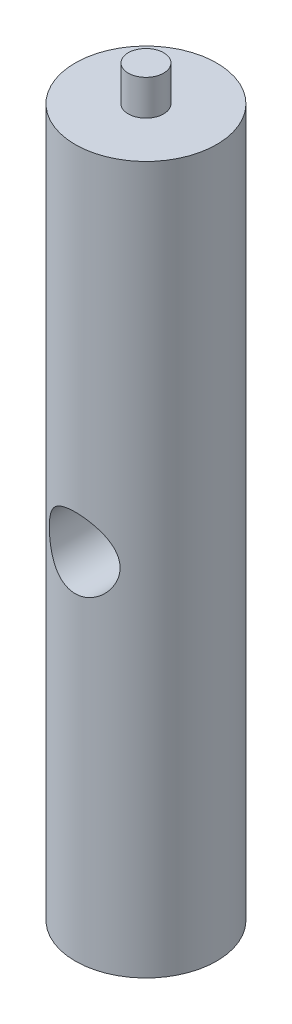
ISO-10303-21;
HEADER;
FILE_DESCRIPTION(('STEP AP214'),'2;1');
FILE_NAME('part.step','',(''),(''),'','','');
FILE_SCHEMA(('AUTOMOTIVE_DESIGN { 1 0 10303 214 1 1 1 1 }'));
ENDSEC;
DATA;
#1=APPLICATION_CONTEXT('core data for automotive mechanical design processes');
#2=APPLICATION_PROTOCOL_DEFINITION('international standard','automotive_design',2000,#1);
#3=PRODUCT_CONTEXT('',#1,'mechanical');
#4=PRODUCT('Part','Part','',(#3));
#5=PRODUCT_RELATED_PRODUCT_CATEGORY('part','',(#4));
#6=PRODUCT_DEFINITION_FORMATION('','',#4);
#7=PRODUCT_DEFINITION_CONTEXT('part definition',#1,'design');
#8=PRODUCT_DEFINITION('design','',#6,#7);
#9=PRODUCT_DEFINITION_SHAPE('','',#8);
#10=(LENGTH_UNIT() NAMED_UNIT(*) SI_UNIT(.MILLI.,.METRE.));
#11=(NAMED_UNIT(*) PLANE_ANGLE_UNIT() SI_UNIT($,.RADIAN.));
#12=(NAMED_UNIT(*) SI_UNIT($,.STERADIAN.) SOLID_ANGLE_UNIT());
#13=UNCERTAINTY_MEASURE_WITH_UNIT(LENGTH_MEASURE(1.E-05),#10,'distance_accuracy_value','');
#14=(GEOMETRIC_REPRESENTATION_CONTEXT(3) GLOBAL_UNCERTAINTY_ASSIGNED_CONTEXT((#13)) GLOBAL_UNIT_ASSIGNED_CONTEXT((#10,
#11,#12)) REPRESENTATION_CONTEXT('',''));
#15=CARTESIAN_POINT('',(0.,0.,0.));
#16=DIRECTION('',(0.,0.,1.));
#17=DIRECTION('',(1.,0.,0.));
#18=AXIS2_PLACEMENT_3D('',#15,#16,#17);
#19=CARTESIAN_POINT('',(0.,200.,0.));
#20=DIRECTION('',(0.,-1.,0.));
#21=DIRECTION('',(0.,0.,-1.));
#22=AXIS2_PLACEMENT_3D('',#19,#20,#21);
#23=CYLINDRICAL_SURFACE('',#22,20.);
#24=CARTESIAN_POINT('',(0.,200.,0.));
#25=DIRECTION('',(0.,1.,0.));
#26=DIRECTION('',(0.,0.,1.));
#27=AXIS2_PLACEMENT_3D('',#24,#25,#26);
#28=CIRCLE('',#27,20.);
#29=CARTESIAN_POINT('',(0.,200.,20.));
#30=VERTEX_POINT('',#29);
#31=EDGE_CURVE('E47',#30,#30,#28,.T.);
#32=ORIENTED_EDGE('',*,*,#31,.F.);
#33=EDGE_LOOP('',(#32));
#34=FACE_BOUND('',#33,.T.);
#35=CARTESIAN_POINT('',(0.,0.,0.));
#36=DIRECTION('',(0.,1.,0.));
#37=DIRECTION('',(0.,0.,1.));
#38=AXIS2_PLACEMENT_3D('',#35,#36,#37);
#39=CIRCLE('',#38,20.);
#40=CARTESIAN_POINT('',(0.,0.,20.));
#41=VERTEX_POINT('',#40);
#42=EDGE_CURVE('E53',#41,#41,#39,.T.);
#43=ORIENTED_EDGE('',*,*,#42,.T.);
#44=EDGE_LOOP('',(#43));
#45=FACE_BOUND('',#44,.T.);
#46=CARTESIAN_POINT('',(0.,90.,20.));
#47=CARTESIAN_POINT('',(0.26297774757047,90.0000008688457,19.9999992010162));
#48=CARTESIAN_POINT('',(0.525973881907791,90.0103855139446,19.9948010837));
#49=CARTESIAN_POINT('',(1.05002923117121,90.0518058248596,19.9741395354228));
#50=CARTESIAN_POINT('',(1.31108755349614,90.0828504745331,19.9586716387275));
#51=CARTESIAN_POINT('',(1.82963226043827,90.1652919104015,19.9178362229901));
#52=CARTESIAN_POINT('',(2.08711188872545,90.2167228854821,19.8924520749392));
#53=CARTESIAN_POINT('',(2.59618182802919,90.3393382141296,19.8324363448083));
#54=CARTESIAN_POINT('',(2.84777272531199,90.4105205921512,19.7978056875818));
#55=CARTESIAN_POINT('',(3.34246836822569,90.5715690021721,19.720303023444));
#56=CARTESIAN_POINT('',(3.58560245696294,90.6613608674556,19.6774637808779));
#57=CARTESIAN_POINT('',(4.06298432085464,90.8589443216841,19.5844658749963));
#58=CARTESIAN_POINT('',(4.29723190454893,90.9667362981723,19.5343070540929));
#59=CARTESIAN_POINT('',(4.75551398861711,91.1993692365252,19.4278257394007));
#60=CARTESIAN_POINT('',(4.97955221985717,91.3242039026448,19.371505523214));
#61=CARTESIAN_POINT('',(5.41653080360956,91.5900869290184,19.2538936046229));
#62=CARTESIAN_POINT('',(5.62946673237804,91.7311416815311,19.1925999450287));
#63=CARTESIAN_POINT('',(6.0557115363693,92.0375045633857,19.0625536763854));
#64=CARTESIAN_POINT('',(6.26826892607329,92.2037622034194,18.9935741626949));
#65=CARTESIAN_POINT('',(6.67880739057352,92.5524451303149,18.8531326273725));
#66=CARTESIAN_POINT('',(6.87678763090648,92.734871341425,18.7816704639664));
#67=CARTESIAN_POINT('',(7.25738906236845,93.1150385796703,18.6379106306311));
#68=CARTESIAN_POINT('',(7.44000060064985,93.3127890842059,18.5656124675679));
#69=CARTESIAN_POINT('',(7.78888361749309,93.7226019562248,18.4219676840917));
#70=CARTESIAN_POINT('',(7.95515202519226,93.9346670008214,18.3506212446753));
#71=CARTESIAN_POINT('',(8.28271110573769,94.3891931986204,18.2052535437119));
#72=CARTESIAN_POINT('',(8.44260565220416,94.6327353643842,18.1314567024133));
#73=CARTESIAN_POINT('',(8.74109142208519,95.1339584798331,17.9894590508883));
#74=CARTESIAN_POINT('',(8.87969167215241,95.3916333754464,17.9212558752544));
#75=CARTESIAN_POINT('',(9.13438777848807,95.9196992031313,17.7927881626278));
#76=CARTESIAN_POINT('',(9.25049044721743,96.1900862549388,17.7325212242509));
#77=CARTESIAN_POINT('',(9.45894522420918,96.74188595345,17.6222099564149));
#78=CARTESIAN_POINT('',(9.55129996419766,97.0232973744558,17.5721644943465));
#79=CARTESIAN_POINT('',(9.70625458779874,97.5779150400595,17.4870229092242));
#80=CARTESIAN_POINT('',(9.77030307761468,97.85060625478,17.4512120054423));
#81=CARTESIAN_POINT('',(9.87543221046261,98.4017164655358,17.3919377517219));
#82=CARTESIAN_POINT('',(9.91651383598184,98.6801352160276,17.368473873599));
#83=CARTESIAN_POINT('',(9.97504777353869,99.2400145991865,17.3349233192211));
#84=CARTESIAN_POINT('',(9.99252007209236,99.521472455347,17.3248253281998));
#85=CARTESIAN_POINT('',(10.0036080043825,100.085002509837,17.3184259915651));
#86=CARTESIAN_POINT('',(9.99722591425207,100.367074646986,17.3221233296318));
#87=CARTESIAN_POINT('',(9.96291632672931,100.895404797903,17.3418743842694));
#88=CARTESIAN_POINT('',(9.93766509151721,101.141900171358,17.3563927185974));
#89=CARTESIAN_POINT('',(9.8690882825972,101.631639224296,17.3954780340008));
#90=CARTESIAN_POINT('',(9.82575672853391,101.874881800364,17.4200483398744));
#91=CARTESIAN_POINT('',(9.72152759312324,102.356391725029,17.4784283554102));
#92=CARTESIAN_POINT('',(9.66063238238804,102.594659740403,17.5122368181421));
#93=CARTESIAN_POINT('',(9.5218798945916,103.064953564235,17.5880654989193));
#94=CARTESIAN_POINT('',(9.44401584795466,103.296976839782,17.6300889935922));
#95=CARTESIAN_POINT('',(9.27007793534026,103.758710591528,17.7221768246774));
#96=CARTESIAN_POINT('',(9.17362860412847,103.988247053267,17.7724029635355));
#97=CARTESIAN_POINT('',(8.96447979140212,104.438438169497,17.878810533816));
#98=CARTESIAN_POINT('',(8.85177491107831,104.659089841894,17.9349939421242));
#99=CARTESIAN_POINT('',(8.61087933619458,105.090561774616,18.0518884826287));
#100=CARTESIAN_POINT('',(8.48268586368169,105.301380261885,18.1126004262899));
#101=CARTESIAN_POINT('',(8.21155546672611,105.712352366209,18.2371218065418));
#102=CARTESIAN_POINT('',(8.06861764351119,105.912505331995,18.3009314318325));
#103=CARTESIAN_POINT('',(7.74962298190964,106.326131679983,18.4384710076206));
#104=CARTESIAN_POINT('',(7.57166567582239,106.538066103339,18.5124312542501));
#105=CARTESIAN_POINT('',(7.19890817206694,106.946374864162,18.6605447929763));
#106=CARTESIAN_POINT('',(7.00411219662653,107.142753078755,18.7346980321841));
#107=CARTESIAN_POINT('',(6.5984132459434,107.51914658076,18.8814062531242));
#108=CARTESIAN_POINT('',(6.38749704374535,107.699148159757,18.9539598580541));
#109=CARTESIAN_POINT('',(5.95079617043249,108.041452863503,19.0955673475654));
#110=CARTESIAN_POINT('',(5.72501741077281,108.20376295748,19.164622604476));
#111=CARTESIAN_POINT('',(5.24872768197162,108.516795865489,19.3006480329725));
#112=CARTESIAN_POINT('',(4.99755374827171,108.666620845972,19.3673693587667));
#113=CARTESIAN_POINT('',(4.48152997851449,108.94436923693,19.4932401539485));
#114=CARTESIAN_POINT('',(4.21667950634011,109.072291627486,19.5523892706948));
#115=CARTESIAN_POINT('',(3.67526022803788,109.304794303463,19.6613492326779));
#116=CARTESIAN_POINT('',(3.39869900661397,109.409389430233,19.7111660121174));
#117=CARTESIAN_POINT('',(2.83582264507487,109.594050778872,19.7999810198758));
#118=CARTESIAN_POINT('',(2.54950863124168,109.674119822488,19.8389804926862));
#119=CARTESIAN_POINT('',(1.99360082076712,109.803065861159,19.9021913169255));
#120=CARTESIAN_POINT('',(1.72458658463509,109.853977242961,19.9273600412885));
#121=CARTESIAN_POINT('',(1.18250594424725,109.933615158093,19.9668602547768));
#122=CARTESIAN_POINT('',(0.909439761223932,109.96234289812,19.9811923333691));
#123=CARTESIAN_POINT('',(0.361621452061389,109.997226320783,19.9986076087938));
#124=CARTESIAN_POINT('',(0.0868700440476566,110.003391028328,20.0016953032259));
#125=CARTESIAN_POINT('',(-0.462095284936289,109.99308881237,19.996544733302));
#126=CARTESIAN_POINT('',(-0.736309229155628,109.976622890451,19.9883069701865));
#127=CARTESIAN_POINT('',(-1.26069578442054,109.923437938302,19.9618171280824));
#128=CARTESIAN_POINT('',(-1.51108216427541,109.888390427179,19.9443921243345));
#129=CARTESIAN_POINT('',(-2.00770334634759,109.799630004821,19.9005341339856));
#130=CARTESIAN_POINT('',(-2.25393841461835,109.745918294559,19.8741017269811));
#131=CARTESIAN_POINT('',(-2.74068446119059,109.620386007905,19.812845023159));
#132=CARTESIAN_POINT('',(-2.98119512032806,109.548564424372,19.7780202596251));
#133=CARTESIAN_POINT('',(-3.45505082107349,109.387505341627,19.7007681992834));
#134=CARTESIAN_POINT('',(-3.6883955611277,109.298267110652,19.6583405830473));
#135=CARTESIAN_POINT('',(-4.15316088617014,109.100375275681,19.5655046555384));
#136=CARTESIAN_POINT('',(-4.38433936906093,108.991242961166,19.5149041886911));
#137=CARTESIAN_POINT('',(-4.83663774643758,108.756252103637,19.4077573479828));
#138=CARTESIAN_POINT('',(-5.05775400766402,108.630387582296,19.3512088504371));
#139=CARTESIAN_POINT('',(-5.70436813169987,108.229056513553,19.1744474473865));
#140=CARTESIAN_POINT('',(-6.11337858448959,107.929746332339,19.0470672570173));
#141=CARTESIAN_POINT('',(-6.91779518371264,107.24229945831,18.7707873202954));
#142=CARTESIAN_POINT('',(-7.30792110762594,106.848326292008,18.6210027147805));
#143=CARTESIAN_POINT('',(-7.84082560671492,106.21273944141,18.3999640224111));
#144=CARTESIAN_POINT('',(-8.0098494240951,105.993264786536,18.3268393772916));
#145=CARTESIAN_POINT('',(-8.32960568094727,105.540260557236,18.183737266458));
#146=CARTESIAN_POINT('',(-8.48033548307859,105.306728963546,18.1137602554328));
#147=CARTESIAN_POINT('',(-8.76928163027866,104.815074006157,17.9757225676596));
#148=CARTESIAN_POINT('',(-8.90652817819506,104.556306693248,17.9079221139821));
#149=CARTESIAN_POINT('',(-9.15837639012035,104.026188455448,17.7804404562871));
#150=CARTESIAN_POINT('',(-9.27298894306127,103.754843659386,17.7207553524022));
#151=CARTESIAN_POINT('',(-9.47827705930681,103.201450136701,17.6118078617936));
#152=CARTESIAN_POINT('',(-9.568971851296,102.919410218377,17.5625371088176));
#153=CARTESIAN_POINT('',(-9.72530086409336,102.346616784648,17.4764560330943));
#154=CARTESIAN_POINT('',(-9.79093896514152,102.055864625934,17.4396437811433));
#155=CARTESIAN_POINT('',(-9.89107565144743,101.496475203281,17.3830260812378));
#156=CARTESIAN_POINT('',(-9.92795857968716,101.228394245327,17.3619273114046));
#157=CARTESIAN_POINT('',(-9.97987692141645,100.689439340699,17.332136815937));
#158=CARTESIAN_POINT('',(-9.99491382071395,100.418565585233,17.3234442465237));
#159=CARTESIAN_POINT('',(-10.0029096686844,99.8764864311019,17.3188284226879));
#160=CARTESIAN_POINT('',(-9.9958767833924,99.60528119221,17.3229004452416));
#161=CARTESIAN_POINT('',(-9.95985898725887,99.0648278902362,17.3436339919872));
#162=CARTESIAN_POINT('',(-9.93087497508661,98.7955797474872,17.3602950007916));
#163=CARTESIAN_POINT('',(-9.85519722920277,98.2868855546067,17.4033551463061));
#164=CARTESIAN_POINT('',(-9.81046230963216,98.047051991075,17.4286705637748));
#165=CARTESIAN_POINT('',(-9.70388285528389,97.5722708021732,17.4882355534742));
#166=CARTESIAN_POINT('',(-9.64203265928581,97.3373248211636,17.5224880816187));
#167=CARTESIAN_POINT('',(-9.50186064219782,96.873776383597,17.5988921487312));
#168=CARTESIAN_POINT('',(-9.42354151869526,96.6451728950817,17.6410423939411));
#169=CARTESIAN_POINT('',(-9.25107208633865,96.1953015116558,17.7320944008379));
#170=CARTESIAN_POINT('',(-9.15691467555994,95.9740369610644,17.7809991895098));
#171=CARTESIAN_POINT('',(-8.94668289722953,95.5253741078771,17.8877520145129));
#172=CARTESIAN_POINT('',(-8.82956366921284,95.2985558213999,17.9459794825375));
#173=CARTESIAN_POINT('',(-8.57895403368728,94.855454569128,18.067122458149));
#174=CARTESIAN_POINT('',(-8.44546216273869,94.6391725475163,18.130038384608));
#175=CARTESIAN_POINT('',(-8.16285657798004,94.2179486226405,18.2590224525038));
#176=CARTESIAN_POINT('',(-8.01373739051541,94.0130107314619,18.3250916939848));
#177=CARTESIAN_POINT('',(-7.70065351710477,93.6153314004298,18.4588439084551));
#178=CARTESIAN_POINT('',(-7.53668670721057,93.4225917122467,18.5265271112979));
#179=CARTESIAN_POINT('',(-7.17380336462424,93.0274109291298,18.6702735648096));
#180=CARTESIAN_POINT('',(-6.97306234663123,92.8266468254377,18.746353564782));
#181=CARTESIAN_POINT('',(-6.55492133587247,92.442648592264,18.8966226391637));
#182=CARTESIAN_POINT('',(-6.33752607360945,92.2594095179455,18.9708122426046));
#183=CARTESIAN_POINT('',(-5.88693376044407,91.9114217798959,19.1154396310611));
#184=CARTESIAN_POINT('',(-5.65372458790795,91.7466875633574,19.1858744624017));
#185=CARTESIAN_POINT('',(-5.17289544211031,91.4371208723595,19.3210638569054));
#186=CARTESIAN_POINT('',(-4.9252763003718,91.29228725116,19.3858187472881));
#187=CARTESIAN_POINT('',(-4.41518835199795,91.0228117220033,19.5083417849818));
#188=CARTESIAN_POINT('',(-4.15262447046934,90.898324669662,19.5660555714726));
#189=CARTESIAN_POINT('',(-3.61607511779454,90.6721526367756,19.6722841833782));
#190=CARTESIAN_POINT('',(-3.34209105214397,90.5704648600651,19.7208001367275));
#191=CARTESIAN_POINT('',(-2.78539452130533,90.3913125066932,19.8070877528213));
#192=CARTESIAN_POINT('',(-2.50270444198694,90.3137907121048,19.8448847753657));
#193=CARTESIAN_POINT('',(-1.93047321727418,90.1837239099316,19.908692874149));
#194=CARTESIAN_POINT('',(-1.64093637072213,90.1311636452079,19.9347111494098));
#195=CARTESIAN_POINT('',(-1.12608352412094,90.0610510964916,19.9695276660452));
#196=CARTESIAN_POINT('',(-0.901651680276712,90.038176533686,19.9809348086311));
#197=CARTESIAN_POINT('',(-0.451484431282411,90.0076504024285,19.9961714231232));
#198=CARTESIAN_POINT('',(-0.225748990324603,89.9999992541535,20.0000006858747));
#199=CARTESIAN_POINT('',(0.,90.,20.));
#200=B_SPLINE_CURVE_WITH_KNOTS('',3,(#46,#47,#48,#49,#50,#51,#52,#53,#54,#55,#56,#57,#58,#59,
#60,#61,#62,#63,#64,#65,#66,#67,#68,#69,#70,#71,#72,#73,#74,#75,#76,#77,#78,#79,#80,#81,#82,#83,
#84,#85,#86,#87,#88,#89,#90,#91,#92,#93,#94,#95,#96,#97,#98,#99,#100,#101,#102,#103,#104,#105,
#106,#107,#108,#109,#110,#111,#112,#113,#114,#115,#116,#117,#118,#119,#120,#121,#122,#123,#124,
#125,#126,#127,#128,#129,#130,#131,#132,#133,#134,#135,#136,#137,#138,#139,#140,#141,#142,#143,
#144,#145,#146,#147,#148,#149,#150,#151,#152,#153,#154,#155,#156,#157,#158,#159,#160,#161,#162,
#163,#164,#165,#166,#167,#168,#169,#170,#171,#172,#173,#174,#175,#176,#177,#178,#179,#180,#181,
#182,#183,#184,#185,#186,#187,#188,#189,#190,#191,#192,#193,#194,#195,#196,#197,#198,#199),
.UNSPECIFIED.,.T.,.F.,(4,2,2,2,2,2,2,2,2,2,2,2,2,2,2,2,2,2,2,2,2,2,2,2,2,2,2,2,2,2,2,2,2,2,2,2,
2,2,2,2,2,2,2,2,2,2,2,2,2,2,2,2,2,2,2,2,2,2,2,2,2,2,2,2,2,2,2,2,2,2,2,2,2,2,2,2,4),(0.,
0.788710589251,1.57776436803952,2.36814706638946,3.15845073874465,3.94566328103173,
4.73289277422682,5.51983223968625,6.30708290401818,7.14179607204601,7.97655698581609,
8.81183834708131,9.64727635829488,10.5477781072242,11.447897073936,12.3477430494904,
13.2474892618302,14.0934532489038,14.9393810441651,15.7845922682139,16.6297228461313,
17.3734776288846,18.1174786157194,18.8613792297722,19.6055771618311,20.3667813084855,
21.1282388516736,21.889833169209,22.6514739387577,23.509891476961,24.3680943913845,
25.2270091977564,26.0855844184834,26.9843425878092,27.8831425974923,28.781369127958,
29.6794922778509,30.5032194900487,31.3269018918016,32.1502547956571,32.9735712608452,
33.7329722323225,34.4923243480979,35.2517187027837,36.0111449703724,36.7921013676949,
37.5733375502822,39.1349970223263,40.8500130119071,41.7087612506847,42.5676331434657,
43.4684238669888,44.3687801699595,45.2684104094407,46.167901277019,46.9810473193186,
47.7941380547513,48.6069279741809,49.4196846201562,50.1547113408423,50.889981477547,
51.6251312717133,52.3606115917997,53.1452977478638,53.9300540928963,54.7150862327853,
55.5002308492403,56.3809909668478,57.2615018327172,58.1426954259119,59.0238382204153,
59.9114030040692,60.7988588747469,61.6841972652664,62.5689938151569,63.2460309664338,
63.9230868041488),.UNSPECIFIED.);
#201=CARTESIAN_POINT('',(0.,90.,20.));
#202=VERTEX_POINT('',#201);
#203=EDGE_CURVE('E42',#202,#202,#200,.T.);
#204=ORIENTED_EDGE('',*,*,#203,.F.);
#205=EDGE_LOOP('',(#204));
#206=FACE_BOUND('',#205,.T.);
#207=CARTESIAN_POINT('',(0.,110.,-20.));
#208=CARTESIAN_POINT('',(0.26297774757047,109.999999131154,-19.9999992010162));
#209=CARTESIAN_POINT('',(0.525973881907791,109.989614486055,-19.9948010837));
#210=CARTESIAN_POINT('',(1.05002923117121,109.94819417514,-19.9741395354228));
#211=CARTESIAN_POINT('',(1.31108755349614,109.917149525467,-19.9586716387275));
#212=CARTESIAN_POINT('',(1.82963226043827,109.834708089599,-19.9178362229901));
#213=CARTESIAN_POINT('',(2.08711188872545,109.783277114518,-19.8924520749392));
#214=CARTESIAN_POINT('',(2.59618182802919,109.66066178587,-19.8324363448083));
#215=CARTESIAN_POINT('',(2.84777272531199,109.589479407849,-19.7978056875818));
#216=CARTESIAN_POINT('',(3.34246836822569,109.428430997828,-19.720303023444));
#217=CARTESIAN_POINT('',(3.58560245696295,109.338639132544,-19.6774637808779));
#218=CARTESIAN_POINT('',(4.06298432085465,109.141055678316,-19.5844658749963));
#219=CARTESIAN_POINT('',(4.29723190454894,109.033263701828,-19.5343070540929));
#220=CARTESIAN_POINT('',(4.75551398861711,108.800630763475,-19.4278257394007));
#221=CARTESIAN_POINT('',(4.97955221985717,108.675796097355,-19.371505523214));
#222=CARTESIAN_POINT('',(5.41653080360956,108.409913070982,-19.2538936046229));
#223=CARTESIAN_POINT('',(5.62946673237804,108.268858318469,-19.1925999450287));
#224=CARTESIAN_POINT('',(6.05571153636931,107.962495436614,-19.0625536763854));
#225=CARTESIAN_POINT('',(6.2682689260733,107.796237796581,-18.9935741626949));
#226=CARTESIAN_POINT('',(6.67880739057353,107.447554869685,-18.8531326273725));
#227=CARTESIAN_POINT('',(6.87678763090649,107.265128658575,-18.7816704639663));
#228=CARTESIAN_POINT('',(7.25738906236846,106.88496142033,-18.6379106306311));
#229=CARTESIAN_POINT('',(7.44000060064986,106.687210915794,-18.5656124675679));
#230=CARTESIAN_POINT('',(7.7888836174931,106.277398043775,-18.4219676840917));
#231=CARTESIAN_POINT('',(7.95515202519227,106.065332999179,-18.3506212446753));
#232=CARTESIAN_POINT('',(8.2827111057377,105.61080680138,-18.2052535437119));
#233=CARTESIAN_POINT('',(8.44260565220417,105.367264635616,-18.1314567024133));
#234=CARTESIAN_POINT('',(8.7410914220852,104.866041520167,-17.9894590508883));
#235=CARTESIAN_POINT('',(8.87969167215242,104.608366624554,-17.9212558752544));
#236=CARTESIAN_POINT('',(9.13438777848808,104.080300796869,-17.7927881626278));
#237=CARTESIAN_POINT('',(9.25049044721743,103.809913745061,-17.7325212242509));
#238=CARTESIAN_POINT('',(9.45894522420918,103.25811404655,-17.6222099564149));
#239=CARTESIAN_POINT('',(9.55129996419766,102.976702625544,-17.5721644943465));
#240=CARTESIAN_POINT('',(9.70625458779874,102.422084959941,-17.4870229092242));
#241=CARTESIAN_POINT('',(9.77030307761468,102.14939374522,-17.4512120054423));
#242=CARTESIAN_POINT('',(9.87543221046261,101.598283534464,-17.3919377517219));
#243=CARTESIAN_POINT('',(9.91651383598184,101.319864783972,-17.368473873599));
#244=CARTESIAN_POINT('',(9.97504777353869,100.759985400814,-17.3349233192211));
#245=CARTESIAN_POINT('',(9.99252007209236,100.478527544653,-17.3248253281998));
#246=CARTESIAN_POINT('',(10.0036080043825,99.914997490163,-17.3184259915651));
#247=CARTESIAN_POINT('',(9.99722591425207,99.6329253530135,-17.3221233296318));
#248=CARTESIAN_POINT('',(9.96291632672931,99.1045952020966,-17.3418743842694));
#249=CARTESIAN_POINT('',(9.93766509151721,98.8580998286423,-17.3563927185974));
#250=CARTESIAN_POINT('',(9.8690882825972,98.3683607757045,-17.3954780340008));
#251=CARTESIAN_POINT('',(9.82575672853391,98.1251181996355,-17.4200483398744));
#252=CARTESIAN_POINT('',(9.72152759312324,97.6436082749706,-17.4784283554102));
#253=CARTESIAN_POINT('',(9.66063238238804,97.4053402595966,-17.5122368181421));
#254=CARTESIAN_POINT('',(9.5218798945916,96.9350464357646,-17.5880654989193));
#255=CARTESIAN_POINT('',(9.44401584795466,96.7030231602177,-17.6300889935922));
#256=CARTESIAN_POINT('',(9.27007793534026,96.2412894084719,-17.7221768246774));
#257=CARTESIAN_POINT('',(9.17362860412847,96.0117529467327,-17.7724029635355));
#258=CARTESIAN_POINT('',(8.96447979140212,95.5615618305034,-17.878810533816));
#259=CARTESIAN_POINT('',(8.85177491107832,95.3409101581057,-17.9349939421242));
#260=CARTESIAN_POINT('',(8.61087933619458,94.909438225384,-18.0518884826287));
#261=CARTESIAN_POINT('',(8.48268586368169,94.6986197381147,-18.1126004262899));
#262=CARTESIAN_POINT('',(8.21155546672611,94.2876476337912,-18.2371218065419));
#263=CARTESIAN_POINT('',(8.06861764351119,94.0874946680049,-18.3009314318325));
#264=CARTESIAN_POINT('',(7.74962298190964,93.6738683200168,-18.4384710076206));
#265=CARTESIAN_POINT('',(7.57166567582239,93.461933896661,-18.5124312542501));
#266=CARTESIAN_POINT('',(7.19890817206694,93.0536251358376,-18.6605447929763));
#267=CARTESIAN_POINT('',(7.00411219662653,92.8572469212453,-18.7346980321841));
#268=CARTESIAN_POINT('',(6.5984132459434,92.4808534192401,-18.8814062531242));
#269=CARTESIAN_POINT('',(6.38749704374535,92.3008518402429,-18.9539598580541));
#270=CARTESIAN_POINT('',(5.95079617043249,91.9585471364973,-19.0955673475654));
#271=CARTESIAN_POINT('',(5.72501741077281,91.7962370425202,-19.164622604476));
#272=CARTESIAN_POINT('',(5.24872768197162,91.4832041345111,-19.3006480329725));
#273=CARTESIAN_POINT('',(4.99755374827171,91.3333791540281,-19.3673693587667));
#274=CARTESIAN_POINT('',(4.48152997851449,91.0556307630696,-19.4932401539485));
#275=CARTESIAN_POINT('',(4.21667950634011,90.9277083725141,-19.5523892706948));
#276=CARTESIAN_POINT('',(3.67526022803788,90.6952056965372,-19.6613492326779));
#277=CARTESIAN_POINT('',(3.39869900661397,90.5906105697672,-19.7111660121174));
#278=CARTESIAN_POINT('',(2.83582264507487,90.4059492211278,-19.7999810198758));
#279=CARTESIAN_POINT('',(2.54950863124168,90.3258801775116,-19.8389804926862));
#280=CARTESIAN_POINT('',(1.99360082076712,90.1969341388409,-19.9021913169255));
#281=CARTESIAN_POINT('',(1.72458658463509,90.1460227570388,-19.9273600412885));
#282=CARTESIAN_POINT('',(1.18250594424725,90.0663848419067,-19.9668602547768));
#283=CARTESIAN_POINT('',(0.909439761223931,90.03765710188,-19.9811923333691));
#284=CARTESIAN_POINT('',(0.361621452061389,90.0027736792174,-19.9986076087938));
#285=CARTESIAN_POINT('',(0.0868700440476565,89.9966089716722,-20.0016953032259));
#286=CARTESIAN_POINT('',(-0.462095284936289,90.0069111876297,-19.996544733302));
#287=CARTESIAN_POINT('',(-0.736309229155628,90.0233771095491,-19.9883069701865));
#288=CARTESIAN_POINT('',(-1.26069578442054,90.0765620616977,-19.9618171280824));
#289=CARTESIAN_POINT('',(-1.51108216427541,90.1116095728206,-19.9443921243345));
#290=CARTESIAN_POINT('',(-2.00770334634759,90.2003699951794,-19.9005341339856));
#291=CARTESIAN_POINT('',(-2.25393841461835,90.2540817054405,-19.8741017269811));
#292=CARTESIAN_POINT('',(-2.74068446119059,90.3796139920955,-19.812845023159));
#293=CARTESIAN_POINT('',(-2.98119512032806,90.4514355756276,-19.7780202596251));
#294=CARTESIAN_POINT('',(-3.45505082107349,90.6124946583728,-19.7007681992834));
#295=CARTESIAN_POINT('',(-3.6883955611277,90.7017328893482,-19.6583405830473));
#296=CARTESIAN_POINT('',(-4.15316088617014,90.8996247243195,-19.5655046555384));
#297=CARTESIAN_POINT('',(-4.38433936906093,91.008757038834,-19.5149041886911));
#298=CARTESIAN_POINT('',(-4.83663774643758,91.2437478963626,-19.4077573479828));
#299=CARTESIAN_POINT('',(-5.05775400766402,91.3696124177045,-19.3512088504371));
#300=CARTESIAN_POINT('',(-5.70436813169987,91.7709434864471,-19.1744474473865));
#301=CARTESIAN_POINT('',(-6.11337858448959,92.070253667661,-19.0470672570173));
#302=CARTESIAN_POINT('',(-6.91779518371264,92.7577005416899,-18.7707873202954));
#303=CARTESIAN_POINT('',(-7.30792110762594,93.1516737079917,-18.6210027147805));
#304=CARTESIAN_POINT('',(-7.84082560671492,93.7872605585902,-18.3999640224111));
#305=CARTESIAN_POINT('',(-8.00984942409511,94.0067352134642,-18.3268393772916));
#306=CARTESIAN_POINT('',(-8.32960568094727,94.4597394427642,-18.183737266458));
#307=CARTESIAN_POINT('',(-8.48033548307859,94.6932710364541,-18.1137602554328));
#308=CARTESIAN_POINT('',(-8.76928163027866,95.1849259938434,-17.9757225676596));
#309=CARTESIAN_POINT('',(-8.90652817819506,95.4436933067517,-17.9079221139821));
#310=CARTESIAN_POINT('',(-9.15837639012034,95.9738115445517,-17.7804404562871));
#311=CARTESIAN_POINT('',(-9.27298894306126,96.2451563406136,-17.7207553524022));
#312=CARTESIAN_POINT('',(-9.4782770593068,96.7985498632991,-17.6118078617936));
#313=CARTESIAN_POINT('',(-9.568971851296,97.0805897816226,-17.5625371088176));
#314=CARTESIAN_POINT('',(-9.72530086409336,97.6533832153516,-17.4764560330943));
#315=CARTESIAN_POINT('',(-9.79093896514152,97.9441353740658,-17.4396437811433));
#316=CARTESIAN_POINT('',(-9.89107565144743,98.5035247967187,-17.3830260812378));
#317=CARTESIAN_POINT('',(-9.92795857968716,98.7716057546725,-17.3619273114046));
#318=CARTESIAN_POINT('',(-9.97987692141645,99.3105606593006,-17.332136815937));
#319=CARTESIAN_POINT('',(-9.99491382071395,99.5814344147671,-17.3234442465237));
#320=CARTESIAN_POINT('',(-10.0029096686844,100.123513568898,-17.3188284226879));
#321=CARTESIAN_POINT('',(-9.9958767833924,100.39471880779,-17.3229004452416));
#322=CARTESIAN_POINT('',(-9.95985898725887,100.935172109764,-17.3436339919872));
#323=CARTESIAN_POINT('',(-9.93087497508661,101.204420252513,-17.3602950007916));
#324=CARTESIAN_POINT('',(-9.85519722920276,101.713114445393,-17.4033551463061));
#325=CARTESIAN_POINT('',(-9.81046230963215,101.952948008925,-17.4286705637748));
#326=CARTESIAN_POINT('',(-9.70388285528388,102.427729197827,-17.4882355534742));
#327=CARTESIAN_POINT('',(-9.6420326592858,102.662675178836,-17.5224880816187));
#328=CARTESIAN_POINT('',(-9.50186064219782,103.126223616403,-17.5988921487312));
#329=CARTESIAN_POINT('',(-9.42354151869526,103.354827104918,-17.6410423939411));
#330=CARTESIAN_POINT('',(-9.25107208633865,103.804698488344,-17.7320944008379));
#331=CARTESIAN_POINT('',(-9.15691467555994,104.025963038936,-17.7809991895098));
#332=CARTESIAN_POINT('',(-8.94668289722953,104.474625892123,-17.8877520145129));
#333=CARTESIAN_POINT('',(-8.82956366921284,104.7014441786,-17.9459794825375));
#334=CARTESIAN_POINT('',(-8.57895403368728,105.144545430872,-18.067122458149));
#335=CARTESIAN_POINT('',(-8.44546216273869,105.360827452484,-18.130038384608));
#336=CARTESIAN_POINT('',(-8.16285657798004,105.78205137736,-18.2590224525038));
#337=CARTESIAN_POINT('',(-8.01373739051541,105.986989268538,-18.3250916939848));
#338=CARTESIAN_POINT('',(-7.70065351710477,106.38466859957,-18.4588439084551));
#339=CARTESIAN_POINT('',(-7.53668670721057,106.577408287753,-18.5265271112979));
#340=CARTESIAN_POINT('',(-7.17380336462424,106.97258907087,-18.6702735648096));
#341=CARTESIAN_POINT('',(-6.97306234663124,107.173353174562,-18.746353564782));
#342=CARTESIAN_POINT('',(-6.55492133587248,107.557351407736,-18.8966226391637));
#343=CARTESIAN_POINT('',(-6.33752607360947,107.740590482055,-18.9708122426046));
#344=CARTESIAN_POINT('',(-5.88693376044408,108.088578220104,-19.1154396310611));
#345=CARTESIAN_POINT('',(-5.65372458790796,108.253312436643,-19.1858744624017));
#346=CARTESIAN_POINT('',(-5.17289544211031,108.562879127641,-19.3210638569054));
#347=CARTESIAN_POINT('',(-4.9252763003718,108.70771274884,-19.3858187472881));
#348=CARTESIAN_POINT('',(-4.41518835199795,108.977188277997,-19.5083417849818));
#349=CARTESIAN_POINT('',(-4.15262447046933,109.101675330338,-19.5660555714726));
#350=CARTESIAN_POINT('',(-3.61607511779454,109.327847363224,-19.6722841833782));
#351=CARTESIAN_POINT('',(-3.34209105214396,109.429535139935,-19.7208001367275));
#352=CARTESIAN_POINT('',(-2.78539452130533,109.608687493307,-19.8070877528213));
#353=CARTESIAN_POINT('',(-2.50270444198694,109.686209287895,-19.8448847753657));
#354=CARTESIAN_POINT('',(-1.93047321727417,109.816276090068,-19.908692874149));
#355=CARTESIAN_POINT('',(-1.64093637072213,109.868836354792,-19.9347111494098));
#356=CARTESIAN_POINT('',(-1.12608352412094,109.938948903508,-19.9695276660452));
#357=CARTESIAN_POINT('',(-0.901651680276712,109.961823466314,-19.9809348086311));
#358=CARTESIAN_POINT('',(-0.451484431282411,109.992349597571,-19.9961714231232));
#359=CARTESIAN_POINT('',(-0.225748990324603,110.000000745846,-20.0000006858747));
#360=CARTESIAN_POINT('',(0.,110.,-20.));
#361=B_SPLINE_CURVE_WITH_KNOTS('',3,(#207,#208,#209,#210,#211,#212,#213,#214,#215,#216,#217,
#218,#219,#220,#221,#222,#223,#224,#225,#226,#227,#228,#229,#230,#231,#232,#233,#234,#235,#236,
#237,#238,#239,#240,#241,#242,#243,#244,#245,#246,#247,#248,#249,#250,#251,#252,#253,#254,#255,
#256,#257,#258,#259,#260,#261,#262,#263,#264,#265,#266,#267,#268,#269,#270,#271,#272,#273,#274,
#275,#276,#277,#278,#279,#280,#281,#282,#283,#284,#285,#286,#287,#288,#289,#290,#291,#292,#293,
#294,#295,#296,#297,#298,#299,#300,#301,#302,#303,#304,#305,#306,#307,#308,#309,#310,#311,#312,
#313,#314,#315,#316,#317,#318,#319,#320,#321,#322,#323,#324,#325,#326,#327,#328,#329,#330,#331,
#332,#333,#334,#335,#336,#337,#338,#339,#340,#341,#342,#343,#344,#345,#346,#347,#348,#349,#350,
#351,#352,#353,#354,#355,#356,#357,#358,#359,#360),.UNSPECIFIED.,.T.,.F.,(4,2,2,2,2,2,2,2,2,2,2,
2,2,2,2,2,2,2,2,2,2,2,2,2,2,2,2,2,2,2,2,2,2,2,2,2,2,2,2,2,2,2,2,2,2,2,2,2,2,2,2,2,2,2,2,2,2,2,2,
2,2,2,2,2,2,2,2,2,2,2,2,2,2,2,2,2,4),(0.,0.788710589251,1.57776436803952,2.36814706638946,
3.15845073874465,3.94566328103175,4.73289277422682,5.51983223968626,6.30708290401818,
7.14179607204602,7.9765569858161,8.81183834708134,9.64727635829487,10.5477781072243,
11.447897073936,12.3477430494904,13.2474892618302,14.0934532489038,14.9393810441651,
15.7845922682139,16.6297228461313,17.3734776288846,18.1174786157194,18.8613792297722,
19.6055771618311,20.3667813084855,21.1282388516736,21.889833169209,22.6514739387577,
23.509891476961,24.3680943913845,25.2270091977564,26.0855844184834,26.9843425878092,
27.8831425974923,28.781369127958,29.6794922778509,30.5032194900486,31.3269018918016,
32.150254795657,32.9735712608451,33.7329722323225,34.4923243480979,35.2517187027837,
36.0111449703724,36.7921013676949,37.5733375502822,39.1349970223262,40.850013011907,
41.7087612506847,42.5676331434657,43.4684238669888,44.3687801699595,45.2684104094407,
46.167901277019,46.9810473193186,47.7941380547513,48.6069279741809,49.4196846201562,
50.1547113408423,50.889981477547,51.6251312717133,52.3606115917997,53.1452977478638,
53.9300540928963,54.7150862327853,55.5002308492403,56.3809909668478,57.2615018327172,
58.1426954259119,59.0238382204153,59.9114030040692,60.7988588747469,61.6841972652663,
62.5689938151569,63.2460309664337,63.9230868041488),.UNSPECIFIED.);
#362=CARTESIAN_POINT('',(0.,110.,-20.));
#363=VERTEX_POINT('',#362);
#364=EDGE_CURVE('E35',#363,#363,#361,.T.);
#365=ORIENTED_EDGE('',*,*,#364,.F.);
#366=EDGE_LOOP('',(#365));
#367=FACE_BOUND('',#366,.T.);
#368=ADVANCED_FACE('F31',(#34,#45,#206,#367),#23,.T.);
#369=CARTESIAN_POINT('',(0.,200.,0.));
#370=DIRECTION('',(0.,1.,0.));
#371=DIRECTION('',(0.,0.,1.));
#372=AXIS2_PLACEMENT_3D('',#369,#370,#371);
#373=PLANE('',#372);
#374=CARTESIAN_POINT('',(0.,200.,0.));
#375=DIRECTION('',(0.,1.,0.));
#376=DIRECTION('',(0.,0.,1.));
#377=AXIS2_PLACEMENT_3D('',#374,#375,#376);
#378=CIRCLE('',#377,5.);
#379=CARTESIAN_POINT('',(0.,200.,5.));
#380=VERTEX_POINT('',#379);
#381=EDGE_CURVE('E10',#380,#380,#378,.T.);
#382=ORIENTED_EDGE('',*,*,#381,.F.);
#383=EDGE_LOOP('',(#382));
#384=FACE_BOUND('',#383,.T.);
#385=ORIENTED_EDGE('',*,*,#31,.T.);
#386=EDGE_LOOP('',(#385));
#387=FACE_BOUND('',#386,.T.);
#388=ADVANCED_FACE('F66',(#384,#387),#373,.T.);
#389=CARTESIAN_POINT('',(0.,0.,0.));
#390=DIRECTION('',(0.,1.,0.));
#391=DIRECTION('',(0.,0.,1.));
#392=AXIS2_PLACEMENT_3D('',#389,#390,#391);
#393=PLANE('',#392);
#394=ORIENTED_EDGE('',*,*,#42,.F.);
#395=EDGE_LOOP('',(#394));
#396=FACE_BOUND('',#395,.T.);
#397=ADVANCED_FACE('F63',(#396),#393,.F.);
#398=CARTESIAN_POINT('',(0.,100.,20.));
#399=DIRECTION('',(0.,0.,-1.));
#400=DIRECTION('',(-1.,0.,0.));
#401=AXIS2_PLACEMENT_3D('',#398,#399,#400);
#402=CYLINDRICAL_SURFACE('',#401,10.);
#403=ORIENTED_EDGE('',*,*,#203,.T.);
#404=EDGE_LOOP('',(#403));
#405=FACE_BOUND('',#404,.T.);
#406=ORIENTED_EDGE('',*,*,#364,.T.);
#407=EDGE_LOOP('',(#406));
#408=FACE_BOUND('',#407,.T.);
#409=ADVANCED_FACE('F57',(#405,#408),#402,.F.);
#410=CARTESIAN_POINT('',(0.,210.,0.));
#411=DIRECTION('',(0.,-1.,0.));
#412=DIRECTION('',(0.,0.,-1.));
#413=AXIS2_PLACEMENT_3D('',#410,#411,#412);
#414=CYLINDRICAL_SURFACE('',#413,5.);
#415=CARTESIAN_POINT('',(0.,210.,0.));
#416=DIRECTION('',(0.,1.,0.));
#417=DIRECTION('',(0.,0.,1.));
#418=AXIS2_PLACEMENT_3D('',#415,#416,#417);
#419=CIRCLE('',#418,5.);
#420=CARTESIAN_POINT('',(0.,210.,5.));
#421=VERTEX_POINT('',#420);
#422=EDGE_CURVE('E50',#421,#421,#419,.T.);
#423=ORIENTED_EDGE('',*,*,#422,.F.);
#424=EDGE_LOOP('',(#423));
#425=FACE_BOUND('',#424,.T.);
#426=ORIENTED_EDGE('',*,*,#381,.T.);
#427=EDGE_LOOP('',(#426));
#428=FACE_BOUND('',#427,.T.);
#429=ADVANCED_FACE('F62',(#425,#428),#414,.T.);
#430=CARTESIAN_POINT('',(0.,210.,0.));
#431=DIRECTION('',(0.,1.,0.));
#432=DIRECTION('',(0.,0.,1.));
#433=AXIS2_PLACEMENT_3D('',#430,#431,#432);
#434=PLANE('',#433);
#435=ORIENTED_EDGE('',*,*,#422,.T.);
#436=EDGE_LOOP('',(#435));
#437=FACE_BOUND('',#436,.T.);
#438=ADVANCED_FACE('F90',(#437),#434,.T.);
#439=CLOSED_SHELL('',(#368,#388,#397,#409,#429,#438));
#440=MANIFOLD_SOLID_BREP('B2',#439);
#441=ADVANCED_BREP_SHAPE_REPRESENTATION('',(#18,#440),#14);
#442=SHAPE_DEFINITION_REPRESENTATION(#9,#441);
ENDSEC;
END-ISO-10303-21;
